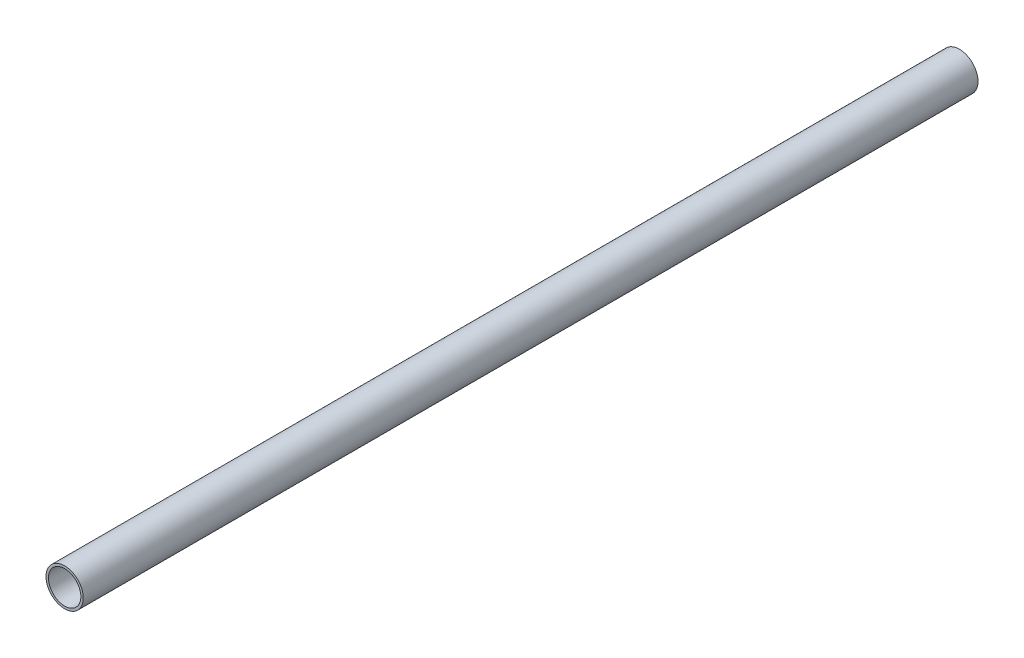
ISO-10303-21;
HEADER;
FILE_DESCRIPTION(('STEP AP214'),'2;1');
FILE_NAME('part.step','',(''),(''),'','','');
FILE_SCHEMA(('AUTOMOTIVE_DESIGN { 1 0 10303 214 1 1 1 1 }'));
ENDSEC;
DATA;
#1=APPLICATION_CONTEXT('core data for automotive mechanical design processes');
#2=APPLICATION_PROTOCOL_DEFINITION('international standard','automotive_design',2000,#1);
#3=PRODUCT_CONTEXT('',#1,'mechanical');
#4=PRODUCT('Part','Part','',(#3));
#5=PRODUCT_RELATED_PRODUCT_CATEGORY('part','',(#4));
#6=PRODUCT_DEFINITION_FORMATION('','',#4);
#7=PRODUCT_DEFINITION_CONTEXT('part definition',#1,'design');
#8=PRODUCT_DEFINITION('design','',#6,#7);
#9=PRODUCT_DEFINITION_SHAPE('','',#8);
#10=(LENGTH_UNIT() NAMED_UNIT(*) SI_UNIT(.MILLI.,.METRE.));
#11=(NAMED_UNIT(*) PLANE_ANGLE_UNIT() SI_UNIT($,.RADIAN.));
#12=(NAMED_UNIT(*) SI_UNIT($,.STERADIAN.) SOLID_ANGLE_UNIT());
#13=UNCERTAINTY_MEASURE_WITH_UNIT(LENGTH_MEASURE(1.E-05),#10,'distance_accuracy_value','');
#14=(GEOMETRIC_REPRESENTATION_CONTEXT(3) GLOBAL_UNCERTAINTY_ASSIGNED_CONTEXT((#13)) GLOBAL_UNIT_ASSIGNED_CONTEXT((#10,
#11,#12)) REPRESENTATION_CONTEXT('',''));
#15=CARTESIAN_POINT('',(0.,0.,0.));
#16=DIRECTION('',(0.,0.,1.));
#17=DIRECTION('',(1.,0.,0.));
#18=AXIS2_PLACEMENT_3D('',#15,#16,#17);
#19=CARTESIAN_POINT('',(0.,0.,0.));
#20=DIRECTION('',(0.,0.,1.));
#21=DIRECTION('',(1.,0.,0.));
#22=AXIS2_PLACEMENT_3D('',#19,#20,#21);
#23=PLANE('',#22);
#24=CARTESIAN_POINT('',(0.,0.,0.));
#25=DIRECTION('',(0.,0.,1.));
#26=DIRECTION('',(1.,0.,0.));
#27=AXIS2_PLACEMENT_3D('',#24,#25,#26);
#28=CIRCLE('',#27,12.7);
#29=CARTESIAN_POINT('',(-12.7,0.,0.));
#30=VERTEX_POINT('',#29);
#31=EDGE_CURVE('E35',#30,#30,#28,.T.);
#32=ORIENTED_EDGE('',*,*,#31,.F.);
#33=EDGE_LOOP('',(#32));
#34=FACE_BOUND('',#33,.T.);
#35=CARTESIAN_POINT('',(0.,0.,0.));
#36=DIRECTION('',(0.,0.,1.));
#37=DIRECTION('',(1.,0.,0.));
#38=AXIS2_PLACEMENT_3D('',#35,#36,#37);
#39=CIRCLE('',#38,11.0998);
#40=CARTESIAN_POINT('',(11.0998,0.,0.));
#41=VERTEX_POINT('',#40);
#42=EDGE_CURVE('E47',#41,#41,#39,.T.);
#43=ORIENTED_EDGE('',*,*,#42,.T.);
#44=EDGE_LOOP('',(#43));
#45=FACE_BOUND('',#44,.T.);
#46=ADVANCED_FACE('F31',(#34,#45),#23,.F.);
#47=CARTESIAN_POINT('',(0.,0.,609.6));
#48=DIRECTION('',(0.,0.,1.));
#49=DIRECTION('',(1.,0.,0.));
#50=AXIS2_PLACEMENT_3D('',#47,#48,#49);
#51=PLANE('',#50);
#52=CARTESIAN_POINT('',(0.,0.,609.6));
#53=DIRECTION('',(0.,0.,1.));
#54=DIRECTION('',(1.,0.,0.));
#55=AXIS2_PLACEMENT_3D('',#52,#53,#54);
#56=CIRCLE('',#55,12.7);
#57=CARTESIAN_POINT('',(-12.7,0.,609.6));
#58=VERTEX_POINT('',#57);
#59=EDGE_CURVE('E10',#58,#58,#56,.T.);
#60=ORIENTED_EDGE('',*,*,#59,.T.);
#61=EDGE_LOOP('',(#60));
#62=FACE_BOUND('',#61,.T.);
#63=CARTESIAN_POINT('',(0.,0.,609.6));
#64=DIRECTION('',(0.,0.,1.));
#65=DIRECTION('',(1.,0.,0.));
#66=AXIS2_PLACEMENT_3D('',#63,#64,#65);
#67=CIRCLE('',#66,11.049);
#68=CARTESIAN_POINT('',(-11.049,0.,609.6));
#69=VERTEX_POINT('',#68);
#70=EDGE_CURVE('E42',#69,#69,#67,.T.);
#71=ORIENTED_EDGE('',*,*,#70,.F.);
#72=EDGE_LOOP('',(#71));
#73=FACE_BOUND('',#72,.T.);
#74=ADVANCED_FACE('F64',(#62,#73),#51,.T.);
#75=CARTESIAN_POINT('',(0.,0.,609.6));
#76=DIRECTION('',(0.,0.,-1.));
#77=DIRECTION('',(-1.,0.,0.));
#78=AXIS2_PLACEMENT_3D('',#75,#76,#77);
#79=CYLINDRICAL_SURFACE('',#78,12.7);
#80=CARTESIAN_POINT('',(-12.7,0.,609.6));
#81=CARTESIAN_POINT('',(-12.7,0.,603.25));
#82=CARTESIAN_POINT('',(-12.7,0.,596.9));
#83=CARTESIAN_POINT('',(-12.7,0.,584.2));
#84=CARTESIAN_POINT('',(-12.7,0.,577.85));
#85=CARTESIAN_POINT('',(-12.7,0.,565.15));
#86=CARTESIAN_POINT('',(-12.7,0.,558.8));
#87=CARTESIAN_POINT('',(-12.7,0.,546.1));
#88=CARTESIAN_POINT('',(-12.7,0.,539.75));
#89=CARTESIAN_POINT('',(-12.7,0.,527.05));
#90=CARTESIAN_POINT('',(-12.7,0.,520.7));
#91=CARTESIAN_POINT('',(-12.7,0.,508.));
#92=CARTESIAN_POINT('',(-12.7,0.,501.65));
#93=CARTESIAN_POINT('',(-12.7,0.,488.95));
#94=CARTESIAN_POINT('',(-12.7,0.,482.6));
#95=CARTESIAN_POINT('',(-12.7,0.,469.9));
#96=CARTESIAN_POINT('',(-12.7,0.,463.55));
#97=CARTESIAN_POINT('',(-12.7,0.,450.85));
#98=CARTESIAN_POINT('',(-12.7,0.,444.5));
#99=CARTESIAN_POINT('',(-12.7,0.,431.8));
#100=CARTESIAN_POINT('',(-12.7,0.,425.45));
#101=CARTESIAN_POINT('',(-12.7,0.,412.75));
#102=CARTESIAN_POINT('',(-12.7,0.,406.4));
#103=CARTESIAN_POINT('',(-12.7,0.,393.7));
#104=CARTESIAN_POINT('',(-12.7,0.,387.35));
#105=CARTESIAN_POINT('',(-12.7,0.,374.65));
#106=CARTESIAN_POINT('',(-12.7,0.,368.3));
#107=CARTESIAN_POINT('',(-12.7,0.,355.6));
#108=CARTESIAN_POINT('',(-12.7,0.,349.25));
#109=CARTESIAN_POINT('',(-12.7,0.,336.55));
#110=CARTESIAN_POINT('',(-12.7,0.,330.2));
#111=CARTESIAN_POINT('',(-12.7,0.,317.5));
#112=CARTESIAN_POINT('',(-12.7,0.,311.15));
#113=CARTESIAN_POINT('',(-12.7,0.,298.45));
#114=CARTESIAN_POINT('',(-12.7,0.,292.1));
#115=CARTESIAN_POINT('',(-12.7,0.,279.4));
#116=CARTESIAN_POINT('',(-12.7,0.,273.05));
#117=CARTESIAN_POINT('',(-12.7,0.,260.35));
#118=CARTESIAN_POINT('',(-12.7,0.,254.));
#119=CARTESIAN_POINT('',(-12.7,0.,241.3));
#120=CARTESIAN_POINT('',(-12.7,0.,234.95));
#121=CARTESIAN_POINT('',(-12.7,0.,222.25));
#122=CARTESIAN_POINT('',(-12.7,0.,215.9));
#123=CARTESIAN_POINT('',(-12.7,0.,203.2));
#124=CARTESIAN_POINT('',(-12.7,0.,196.85));
#125=CARTESIAN_POINT('',(-12.7,0.,184.15));
#126=CARTESIAN_POINT('',(-12.7,0.,177.8));
#127=CARTESIAN_POINT('',(-12.7,0.,165.1));
#128=CARTESIAN_POINT('',(-12.7,0.,158.75));
#129=CARTESIAN_POINT('',(-12.7,0.,146.05));
#130=CARTESIAN_POINT('',(-12.7,0.,139.7));
#131=CARTESIAN_POINT('',(-12.7,0.,127.));
#132=CARTESIAN_POINT('',(-12.7,0.,120.65));
#133=CARTESIAN_POINT('',(-12.7,0.,107.95));
#134=CARTESIAN_POINT('',(-12.7,0.,101.6));
#135=CARTESIAN_POINT('',(-12.7,0.,88.9));
#136=CARTESIAN_POINT('',(-12.7,0.,82.5500000000001));
#137=CARTESIAN_POINT('',(-12.7,0.,69.85));
#138=CARTESIAN_POINT('',(-12.7,0.,63.5));
#139=CARTESIAN_POINT('',(-12.7,0.,50.8));
#140=CARTESIAN_POINT('',(-12.7,0.,44.45));
#141=CARTESIAN_POINT('',(-12.7,0.,31.75));
#142=CARTESIAN_POINT('',(-12.7,0.,25.4));
#143=CARTESIAN_POINT('',(-12.7,0.,12.7));
#144=CARTESIAN_POINT('',(-12.7,0.,6.35000000000001));
#145=CARTESIAN_POINT('',(-12.7,0.,0.));
#146=B_SPLINE_CURVE_WITH_KNOTS('',3,(#80,#81,#82,#83,#84,#85,#86,#87,#88,#89,#90,#91,#92,#93,
#94,#95,#96,#97,#98,#99,#100,#101,#102,#103,#104,#105,#106,#107,#108,#109,#110,#111,#112,#113,
#114,#115,#116,#117,#118,#119,#120,#121,#122,#123,#124,#125,#126,#127,#128,#129,#130,#131,#132,
#133,#134,#135,#136,#137,#138,#139,#140,#141,#142,#143,#144,#145),.UNSPECIFIED.,.F.,.F.,(4,2,2,
2,2,2,2,2,2,2,2,2,2,2,2,2,2,2,2,2,2,2,2,2,2,2,2,2,2,2,2,2,4),(0.,19.05,38.1,57.15,76.2,
95.2500000000001,114.3,133.35,152.4,171.45,190.5,209.55,228.6,247.65,266.7,285.75,304.8,323.85,
342.9,361.95,381.,400.05,419.1,438.15,457.2,476.25,495.3,514.35,533.4,552.45,571.5,590.55,
609.6),.UNSPECIFIED.);
#147=EDGE_CURVE('BSEAM33',#58,#30,#146,.T.);
#148=ORIENTED_EDGE('',*,*,#59,.F.);
#149=ORIENTED_EDGE('',*,*,#31,.T.);
#150=ORIENTED_EDGE('',*,*,#147,.T.);
#151=ORIENTED_EDGE('',*,*,#147,.F.);
#152=EDGE_LOOP('',(#148,#150,#149,#151));
#153=FACE_BOUND('',#152,.T.);
#154=ADVANCED_FACE('F33',(#153),#79,.T.);
#155=CARTESIAN_POINT('',(0.,0.,609.6));
#156=DIRECTION('',(0.,0.,-1.));
#157=DIRECTION('',(-1.,0.,0.));
#158=AXIS2_PLACEMENT_3D('',#155,#156,#157);
#159=CYLINDRICAL_SURFACE('',#158,11.049);
#160=CARTESIAN_POINT('',(0.,0.,50.8));
#161=DIRECTION('',(0.,0.,1.));
#162=DIRECTION('',(1.,0.,0.));
#163=AXIS2_PLACEMENT_3D('',#160,#161,#162);
#164=CIRCLE('',#163,11.049);
#165=CARTESIAN_POINT('',(-11.049,0.,50.8));
#166=VERTEX_POINT('',#165);
#167=EDGE_CURVE('E50',#166,#166,#164,.T.);
#168=CARTESIAN_POINT('',(-11.049,0.,50.8));
#169=CARTESIAN_POINT('',(-11.049,0.,56.6208333333333));
#170=CARTESIAN_POINT('',(-11.049,0.,62.4416666666667));
#171=CARTESIAN_POINT('',(-11.049,0.,74.0833333333333));
#172=CARTESIAN_POINT('',(-11.049,0.,79.9041666666666));
#173=CARTESIAN_POINT('',(-11.049,0.,91.5458333333333));
#174=CARTESIAN_POINT('',(-11.049,0.,97.3666666666666));
#175=CARTESIAN_POINT('',(-11.049,0.,109.008333333333));
#176=CARTESIAN_POINT('',(-11.049,0.,114.829166666667));
#177=CARTESIAN_POINT('',(-11.049,0.,126.470833333333));
#178=CARTESIAN_POINT('',(-11.049,0.,132.291666666667));
#179=CARTESIAN_POINT('',(-11.049,0.,143.933333333333));
#180=CARTESIAN_POINT('',(-11.049,0.,149.754166666667));
#181=CARTESIAN_POINT('',(-11.049,0.,161.395833333333));
#182=CARTESIAN_POINT('',(-11.049,0.,167.216666666667));
#183=CARTESIAN_POINT('',(-11.049,0.,178.858333333333));
#184=CARTESIAN_POINT('',(-11.049,0.,184.679166666667));
#185=CARTESIAN_POINT('',(-11.049,0.,196.320833333333));
#186=CARTESIAN_POINT('',(-11.049,0.,202.141666666667));
#187=CARTESIAN_POINT('',(-11.049,0.,213.783333333333));
#188=CARTESIAN_POINT('',(-11.049,0.,219.604166666667));
#189=CARTESIAN_POINT('',(-11.049,0.,231.245833333333));
#190=CARTESIAN_POINT('',(-11.049,0.,237.066666666667));
#191=CARTESIAN_POINT('',(-11.049,0.,248.708333333333));
#192=CARTESIAN_POINT('',(-11.049,0.,254.529166666667));
#193=CARTESIAN_POINT('',(-11.049,0.,266.170833333333));
#194=CARTESIAN_POINT('',(-11.049,0.,271.991666666667));
#195=CARTESIAN_POINT('',(-11.049,0.,283.633333333333));
#196=CARTESIAN_POINT('',(-11.049,0.,289.454166666667));
#197=CARTESIAN_POINT('',(-11.049,0.,301.095833333333));
#198=CARTESIAN_POINT('',(-11.049,0.,306.916666666667));
#199=CARTESIAN_POINT('',(-11.049,0.,318.558333333333));
#200=CARTESIAN_POINT('',(-11.049,0.,324.379166666667));
#201=CARTESIAN_POINT('',(-11.049,0.,336.020833333333));
#202=CARTESIAN_POINT('',(-11.049,0.,341.841666666667));
#203=CARTESIAN_POINT('',(-11.049,0.,353.483333333333));
#204=CARTESIAN_POINT('',(-11.049,0.,359.304166666667));
#205=CARTESIAN_POINT('',(-11.049,0.,370.945833333333));
#206=CARTESIAN_POINT('',(-11.049,0.,376.766666666667));
#207=CARTESIAN_POINT('',(-11.049,0.,388.408333333333));
#208=CARTESIAN_POINT('',(-11.049,0.,394.229166666667));
#209=CARTESIAN_POINT('',(-11.049,0.,405.870833333333));
#210=CARTESIAN_POINT('',(-11.049,0.,411.691666666667));
#211=CARTESIAN_POINT('',(-11.049,0.,423.333333333333));
#212=CARTESIAN_POINT('',(-11.049,0.,429.154166666667));
#213=CARTESIAN_POINT('',(-11.049,0.,440.795833333333));
#214=CARTESIAN_POINT('',(-11.049,0.,446.616666666667));
#215=CARTESIAN_POINT('',(-11.049,0.,458.258333333333));
#216=CARTESIAN_POINT('',(-11.049,0.,464.079166666667));
#217=CARTESIAN_POINT('',(-11.049,0.,475.720833333333));
#218=CARTESIAN_POINT('',(-11.049,0.,481.541666666667));
#219=CARTESIAN_POINT('',(-11.049,0.,493.183333333333));
#220=CARTESIAN_POINT('',(-11.049,0.,499.004166666667));
#221=CARTESIAN_POINT('',(-11.049,0.,510.645833333333));
#222=CARTESIAN_POINT('',(-11.049,0.,516.466666666667));
#223=CARTESIAN_POINT('',(-11.049,0.,528.108333333333));
#224=CARTESIAN_POINT('',(-11.049,0.,533.929166666667));
#225=CARTESIAN_POINT('',(-11.049,0.,545.570833333333));
#226=CARTESIAN_POINT('',(-11.049,0.,551.391666666667));
#227=CARTESIAN_POINT('',(-11.049,0.,563.033333333333));
#228=CARTESIAN_POINT('',(-11.049,0.,568.854166666667));
#229=CARTESIAN_POINT('',(-11.049,0.,580.495833333333));
#230=CARTESIAN_POINT('',(-11.049,0.,586.316666666667));
#231=CARTESIAN_POINT('',(-11.049,0.,597.958333333333));
#232=CARTESIAN_POINT('',(-11.049,0.,603.779166666667));
#233=CARTESIAN_POINT('',(-11.049,0.,609.6));
#234=B_SPLINE_CURVE_WITH_KNOTS('',3,(#168,#169,#170,#171,#172,#173,#174,#175,#176,#177,#178,
#179,#180,#181,#182,#183,#184,#185,#186,#187,#188,#189,#190,#191,#192,#193,#194,#195,#196,#197,
#198,#199,#200,#201,#202,#203,#204,#205,#206,#207,#208,#209,#210,#211,#212,#213,#214,#215,#216,
#217,#218,#219,#220,#221,#222,#223,#224,#225,#226,#227,#228,#229,#230,#231,#232,#233),
.UNSPECIFIED.,.F.,.F.,(4,2,2,2,2,2,2,2,2,2,2,2,2,2,2,2,2,2,2,2,2,2,2,2,2,2,2,2,2,2,2,2,4),(0.,
17.4625,34.925,52.3875,69.85,87.3125,104.775,122.2375,139.7,157.1625,174.625,192.0875,209.55,
227.0125,244.475,261.9375,279.4,296.8625,314.325,331.7875,349.25,366.7125,384.175,401.6375,
419.1,436.5625,454.025,471.4875,488.95,506.4125,523.875,541.3375,558.8),.UNSPECIFIED.);
#235=EDGE_CURVE('BSEAM58',#166,#69,#234,.T.);
#236=ORIENTED_EDGE('',*,*,#167,.F.);
#237=ORIENTED_EDGE('',*,*,#70,.T.);
#238=ORIENTED_EDGE('',*,*,#235,.T.);
#239=ORIENTED_EDGE('',*,*,#235,.F.);
#240=EDGE_LOOP('',(#236,#238,#237,#239));
#241=FACE_BOUND('',#240,.T.);
#242=ADVANCED_FACE('F58',(#241),#159,.F.);
#243=CARTESIAN_POINT('',(0.,0.,50.8));
#244=DIRECTION('',(0.,0.,1.));
#245=DIRECTION('',(1.,0.,0.));
#246=AXIS2_PLACEMENT_3D('',#243,#244,#245);
#247=PLANE('',#246);
#248=CARTESIAN_POINT('',(0.,0.,50.8));
#249=DIRECTION('',(0.,0.,1.));
#250=DIRECTION('',(1.,0.,0.));
#251=AXIS2_PLACEMENT_3D('',#248,#249,#250);
#252=CIRCLE('',#251,11.0998);
#253=CARTESIAN_POINT('',(11.0998,0.,50.8));
#254=VERTEX_POINT('',#253);
#255=EDGE_CURVE('E46',#254,#254,#252,.T.);
#256=ORIENTED_EDGE('',*,*,#255,.F.);
#257=EDGE_LOOP('',(#256));
#258=FACE_BOUND('',#257,.T.);
#259=ORIENTED_EDGE('',*,*,#167,.T.);
#260=EDGE_LOOP('',(#259));
#261=FACE_BOUND('',#260,.T.);
#262=ADVANCED_FACE('F56',(#258,#261),#247,.F.);
#263=CARTESIAN_POINT('',(0.,0.,50.8));
#264=DIRECTION('',(0.,0.,-1.));
#265=DIRECTION('',(-1.,0.,0.));
#266=AXIS2_PLACEMENT_3D('',#263,#264,#265);
#267=CYLINDRICAL_SURFACE('',#266,11.0998);
#268=ORIENTED_EDGE('',*,*,#255,.T.);
#269=EDGE_LOOP('',(#268));
#270=FACE_BOUND('',#269,.T.);
#271=ORIENTED_EDGE('',*,*,#42,.F.);
#272=EDGE_LOOP('',(#271));
#273=FACE_BOUND('',#272,.T.);
#274=ADVANCED_FACE('F74',(#270,#273),#267,.F.);
#275=CLOSED_SHELL('',(#46,#74,#154,#242,#262,#274));
#276=MANIFOLD_SOLID_BREP('B2',#275);
#277=ADVANCED_BREP_SHAPE_REPRESENTATION('',(#18,#276),#14);
#278=SHAPE_DEFINITION_REPRESENTATION(#9,#277);
ENDSEC;
END-ISO-10303-21;
